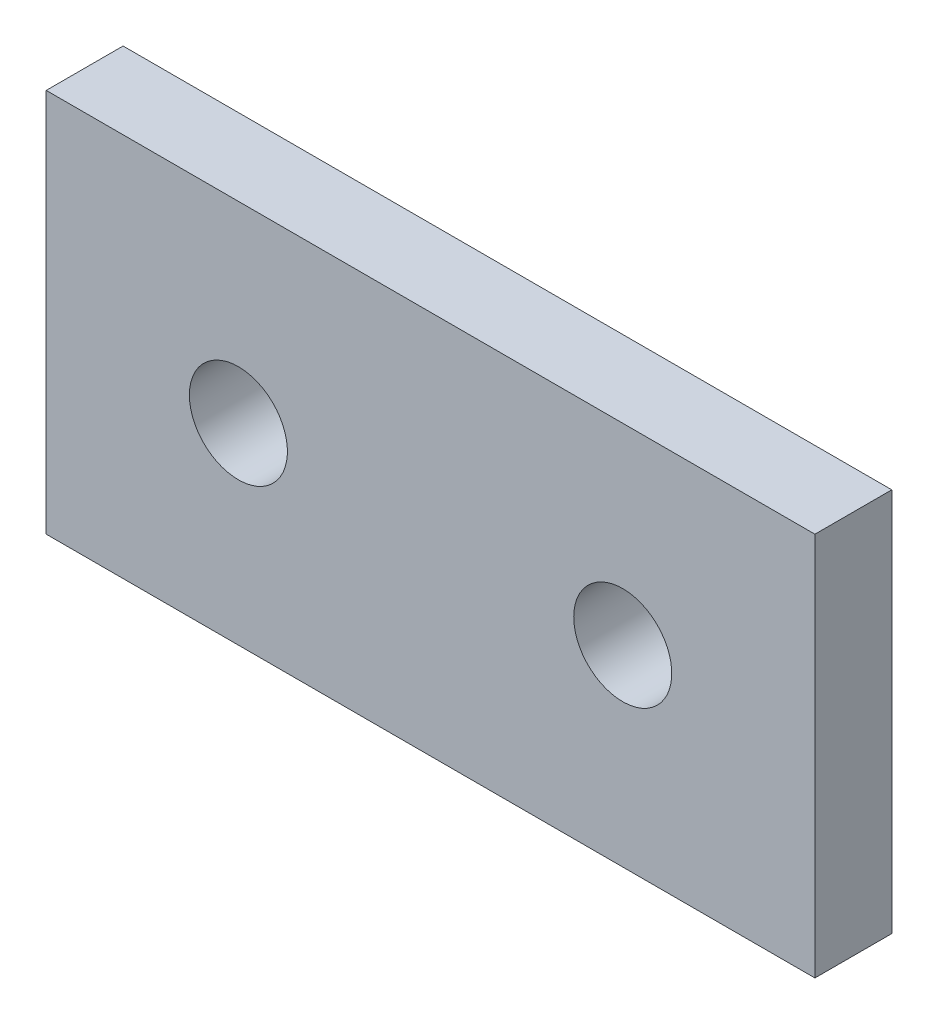
ISO-10303-21;
HEADER;
FILE_DESCRIPTION(('STEP AP214'),'2;1');
FILE_NAME('part.step','',(''),(''),'','','');
FILE_SCHEMA(('AUTOMOTIVE_DESIGN { 1 0 10303 214 1 1 1 1 }'));
ENDSEC;
DATA;
#1=APPLICATION_CONTEXT('core data for automotive mechanical design processes');
#2=APPLICATION_PROTOCOL_DEFINITION('international standard','automotive_design',2000,#1);
#3=PRODUCT_CONTEXT('',#1,'mechanical');
#4=PRODUCT('Part','Part','',(#3));
#5=PRODUCT_RELATED_PRODUCT_CATEGORY('part','',(#4));
#6=PRODUCT_DEFINITION_FORMATION('','',#4);
#7=PRODUCT_DEFINITION_CONTEXT('part definition',#1,'design');
#8=PRODUCT_DEFINITION('design','',#6,#7);
#9=PRODUCT_DEFINITION_SHAPE('','',#8);
#10=(LENGTH_UNIT() NAMED_UNIT(*) SI_UNIT(.MILLI.,.METRE.));
#11=(NAMED_UNIT(*) PLANE_ANGLE_UNIT() SI_UNIT($,.RADIAN.));
#12=(NAMED_UNIT(*) SI_UNIT($,.STERADIAN.) SOLID_ANGLE_UNIT());
#13=UNCERTAINTY_MEASURE_WITH_UNIT(LENGTH_MEASURE(1.E-05),#10,'distance_accuracy_value','');
#14=(GEOMETRIC_REPRESENTATION_CONTEXT(3) GLOBAL_UNCERTAINTY_ASSIGNED_CONTEXT((#13)) GLOBAL_UNIT_ASSIGNED_CONTEXT((#10,
#11,#12)) REPRESENTATION_CONTEXT('',''));
#15=CARTESIAN_POINT('',(0.,0.,0.));
#16=DIRECTION('',(0.,0.,1.));
#17=DIRECTION('',(1.,0.,0.));
#18=AXIS2_PLACEMENT_3D('',#15,#16,#17);
#19=CARTESIAN_POINT('',(20.,10.,0.));
#20=DIRECTION('',(0.,0.,1.));
#21=DIRECTION('',(1.,0.,0.));
#22=AXIS2_PLACEMENT_3D('',#19,#20,#21);
#23=PLANE('',#22);
#24=CARTESIAN_POINT('',(30.,10.,0.));
#25=DIRECTION('',(0.,0.,-1.));
#26=DIRECTION('',(1.,0.,0.));
#27=AXIS2_PLACEMENT_3D('',#24,#25,#26);
#28=CIRCLE('',#27,2.55);
#29=CARTESIAN_POINT('',(27.45,10.,0.));
#30=VERTEX_POINT('',#29);
#31=EDGE_CURVE('E74',#30,#30,#28,.T.);
#32=ORIENTED_EDGE('',*,*,#31,.F.);
#33=EDGE_LOOP('',(#32));
#34=FACE_BOUND('',#33,.T.);
#35=CARTESIAN_POINT('',(10.,10.,0.));
#36=DIRECTION('',(0.,0.,-1.));
#37=DIRECTION('',(1.,0.,0.));
#38=AXIS2_PLACEMENT_3D('',#35,#36,#37);
#39=CIRCLE('',#38,2.55);
#40=CARTESIAN_POINT('',(7.45,10.,0.));
#41=VERTEX_POINT('',#40);
#42=EDGE_CURVE('E143',#41,#41,#39,.T.);
#43=ORIENTED_EDGE('',*,*,#42,.F.);
#44=EDGE_LOOP('',(#43));
#45=FACE_BOUND('',#44,.T.);
#46=DIRECTION('',(0.,-1.,0.));
#47=VECTOR('',#46,1.);
#48=CARTESIAN_POINT('',(0.,20.,0.));
#49=LINE('',#48,#47);
#50=CARTESIAN_POINT('',(0.,20.,0.));
#51=VERTEX_POINT('',#50);
#52=CARTESIAN_POINT('',(0.,0.,0.));
#53=VERTEX_POINT('',#52);
#54=EDGE_CURVE('E28',#51,#53,#49,.T.);
#55=ORIENTED_EDGE('',*,*,#54,.F.);
#56=DIRECTION('',(-1.,0.,0.));
#57=VECTOR('',#56,1.);
#58=CARTESIAN_POINT('',(40.,20.,0.));
#59=LINE('',#58,#57);
#60=CARTESIAN_POINT('',(40.,20.,0.));
#61=VERTEX_POINT('',#60);
#62=EDGE_CURVE('E145',#61,#51,#59,.T.);
#63=ORIENTED_EDGE('',*,*,#62,.F.);
#64=DIRECTION('',(0.,1.,0.));
#65=VECTOR('',#64,1.);
#66=CARTESIAN_POINT('',(40.,0.,0.));
#67=LINE('',#66,#65);
#68=CARTESIAN_POINT('',(40.,0.,0.));
#69=VERTEX_POINT('',#68);
#70=EDGE_CURVE('E97',#69,#61,#67,.T.);
#71=ORIENTED_EDGE('',*,*,#70,.F.);
#72=DIRECTION('',(1.,0.,0.));
#73=VECTOR('',#72,1.);
#74=CARTESIAN_POINT('',(0.,0.,0.));
#75=LINE('',#74,#73);
#76=EDGE_CURVE('E109',#53,#69,#75,.T.);
#77=ORIENTED_EDGE('',*,*,#76,.F.);
#78=EDGE_LOOP('',(#55,#63,#71,#77));
#79=FACE_BOUND('',#78,.T.);
#80=ADVANCED_FACE('F17',(#34,#45,#79),#23,.F.);
#81=CARTESIAN_POINT('',(20.,10.,4.));
#82=DIRECTION('',(0.,0.,1.));
#83=DIRECTION('',(1.,0.,0.));
#84=AXIS2_PLACEMENT_3D('',#81,#82,#83);
#85=PLANE('',#84);
#86=CARTESIAN_POINT('',(30.,10.,4.));
#87=DIRECTION('',(0.,0.,-1.));
#88=DIRECTION('',(1.,0.,0.));
#89=AXIS2_PLACEMENT_3D('',#86,#87,#88);
#90=CIRCLE('',#89,2.55);
#91=CARTESIAN_POINT('',(27.45,10.,4.));
#92=VERTEX_POINT('',#91);
#93=EDGE_CURVE('E133',#92,#92,#90,.T.);
#94=ORIENTED_EDGE('',*,*,#93,.T.);
#95=EDGE_LOOP('',(#94));
#96=FACE_BOUND('',#95,.T.);
#97=CARTESIAN_POINT('',(10.,10.,4.));
#98=DIRECTION('',(0.,0.,-1.));
#99=DIRECTION('',(1.,0.,0.));
#100=AXIS2_PLACEMENT_3D('',#97,#98,#99);
#101=CIRCLE('',#100,2.55);
#102=CARTESIAN_POINT('',(7.45,10.,4.));
#103=VERTEX_POINT('',#102);
#104=EDGE_CURVE('E137',#103,#103,#101,.T.);
#105=ORIENTED_EDGE('',*,*,#104,.T.);
#106=EDGE_LOOP('',(#105));
#107=FACE_BOUND('',#106,.T.);
#108=DIRECTION('',(0.,-1.,0.));
#109=VECTOR('',#108,1.);
#110=CARTESIAN_POINT('',(0.,20.,4.));
#111=LINE('',#110,#109);
#112=CARTESIAN_POINT('',(0.,20.,4.));
#113=VERTEX_POINT('',#112);
#114=CARTESIAN_POINT('',(0.,0.,4.));
#115=VERTEX_POINT('',#114);
#116=EDGE_CURVE('E11',#113,#115,#111,.T.);
#117=ORIENTED_EDGE('',*,*,#116,.T.);
#118=DIRECTION('',(1.,0.,0.));
#119=VECTOR('',#118,1.);
#120=CARTESIAN_POINT('',(0.,0.,4.));
#121=LINE('',#120,#119);
#122=CARTESIAN_POINT('',(40.,0.,4.));
#123=VERTEX_POINT('',#122);
#124=EDGE_CURVE('E112',#115,#123,#121,.T.);
#125=ORIENTED_EDGE('',*,*,#124,.T.);
#126=DIRECTION('',(0.,1.,0.));
#127=VECTOR('',#126,1.);
#128=CARTESIAN_POINT('',(40.,0.,4.));
#129=LINE('',#128,#127);
#130=CARTESIAN_POINT('',(40.,20.,4.));
#131=VERTEX_POINT('',#130);
#132=EDGE_CURVE('E103',#123,#131,#129,.T.);
#133=ORIENTED_EDGE('',*,*,#132,.T.);
#134=DIRECTION('',(-1.,0.,0.));
#135=VECTOR('',#134,1.);
#136=CARTESIAN_POINT('',(40.,20.,4.));
#137=LINE('',#136,#135);
#138=EDGE_CURVE('E136',#131,#113,#137,.T.);
#139=ORIENTED_EDGE('',*,*,#138,.T.);
#140=EDGE_LOOP('',(#117,#125,#133,#139));
#141=FACE_BOUND('',#140,.T.);
#142=ADVANCED_FACE('F113',(#96,#107,#141),#85,.T.);
#143=CARTESIAN_POINT('',(0.,20.,0.));
#144=DIRECTION('',(-1.,0.,0.));
#145=DIRECTION('',(0.,0.,1.));
#146=AXIS2_PLACEMENT_3D('',#143,#144,#145);
#147=PLANE('',#146);
#148=ORIENTED_EDGE('',*,*,#54,.T.);
#149=DIRECTION('',(0.,0.,1.));
#150=VECTOR('',#149,1.);
#151=CARTESIAN_POINT('',(0.,0.,0.));
#152=LINE('',#151,#150);
#153=EDGE_CURVE('E115',#53,#115,#152,.T.);
#154=ORIENTED_EDGE('',*,*,#153,.T.);
#155=ORIENTED_EDGE('',*,*,#116,.F.);
#156=DIRECTION('',(0.,0.,1.));
#157=VECTOR('',#156,1.);
#158=CARTESIAN_POINT('',(0.,20.,0.));
#159=LINE('',#158,#157);
#160=EDGE_CURVE('E142',#51,#113,#159,.T.);
#161=ORIENTED_EDGE('',*,*,#160,.F.);
#162=EDGE_LOOP('',(#148,#154,#155,#161));
#163=FACE_BOUND('',#162,.T.);
#164=ADVANCED_FACE('F200',(#163),#147,.T.);
#165=CARTESIAN_POINT('',(0.,0.,0.));
#166=DIRECTION('',(0.,-1.,0.));
#167=DIRECTION('',(0.,0.,-1.));
#168=AXIS2_PLACEMENT_3D('',#165,#166,#167);
#169=PLANE('',#168);
#170=ORIENTED_EDGE('',*,*,#76,.T.);
#171=DIRECTION('',(0.,0.,1.));
#172=VECTOR('',#171,1.);
#173=CARTESIAN_POINT('',(40.,0.,0.));
#174=LINE('',#173,#172);
#175=EDGE_CURVE('E21',#69,#123,#174,.T.);
#176=ORIENTED_EDGE('',*,*,#175,.T.);
#177=ORIENTED_EDGE('',*,*,#124,.F.);
#178=ORIENTED_EDGE('',*,*,#153,.F.);
#179=EDGE_LOOP('',(#170,#176,#177,#178));
#180=FACE_BOUND('',#179,.T.);
#181=ADVANCED_FACE('F117',(#180),#169,.T.);
#182=CARTESIAN_POINT('',(40.,0.,0.));
#183=DIRECTION('',(1.,0.,0.));
#184=DIRECTION('',(0.,1.,0.));
#185=AXIS2_PLACEMENT_3D('',#182,#183,#184);
#186=PLANE('',#185);
#187=ORIENTED_EDGE('',*,*,#70,.T.);
#188=DIRECTION('',(0.,0.,1.));
#189=VECTOR('',#188,1.);
#190=CARTESIAN_POINT('',(40.,20.,0.));
#191=LINE('',#190,#189);
#192=EDGE_CURVE('E120',#61,#131,#191,.T.);
#193=ORIENTED_EDGE('',*,*,#192,.T.);
#194=ORIENTED_EDGE('',*,*,#132,.F.);
#195=ORIENTED_EDGE('',*,*,#175,.F.);
#196=EDGE_LOOP('',(#187,#193,#194,#195));
#197=FACE_BOUND('',#196,.T.);
#198=ADVANCED_FACE('F119',(#197),#186,.T.);
#199=CARTESIAN_POINT('',(40.,20.,0.));
#200=DIRECTION('',(0.,1.,0.));
#201=DIRECTION('',(1.,0.,0.));
#202=AXIS2_PLACEMENT_3D('',#199,#200,#201);
#203=PLANE('',#202);
#204=ORIENTED_EDGE('',*,*,#62,.T.);
#205=ORIENTED_EDGE('',*,*,#160,.T.);
#206=ORIENTED_EDGE('',*,*,#138,.F.);
#207=ORIENTED_EDGE('',*,*,#192,.F.);
#208=EDGE_LOOP('',(#204,#205,#206,#207));
#209=FACE_BOUND('',#208,.T.);
#210=ADVANCED_FACE('F180',(#209),#203,.T.);
#211=CARTESIAN_POINT('',(10.,10.,0.));
#212=DIRECTION('',(0.,0.,1.));
#213=DIRECTION('',(1.,0.,0.));
#214=AXIS2_PLACEMENT_3D('',#211,#212,#213);
#215=CYLINDRICAL_SURFACE('',#214,2.55);
#216=ORIENTED_EDGE('',*,*,#104,.F.);
#217=DIRECTION('',(0.,0.,-1.));
#218=VECTOR('',#217,1.);
#219=CARTESIAN_POINT('',(7.45,10.,0.));
#220=LINE('',#219,#218);
#221=EDGE_CURVE('E61',#103,#41,#220,.T.);
#222=ORIENTED_EDGE('',*,*,#221,.T.);
#223=ORIENTED_EDGE('',*,*,#42,.T.);
#224=ORIENTED_EDGE('',*,*,#221,.F.);
#225=EDGE_LOOP('',(#216,#222,#223,#224));
#226=FACE_BOUND('',#225,.T.);
#227=ADVANCED_FACE('F175',(#226),#215,.F.);
#228=CARTESIAN_POINT('',(30.,10.,0.));
#229=DIRECTION('',(0.,0.,1.));
#230=DIRECTION('',(1.,0.,0.));
#231=AXIS2_PLACEMENT_3D('',#228,#229,#230);
#232=CYLINDRICAL_SURFACE('',#231,2.55);
#233=ORIENTED_EDGE('',*,*,#93,.F.);
#234=DIRECTION('',(0.,0.,-1.));
#235=VECTOR('',#234,1.);
#236=CARTESIAN_POINT('',(27.45,10.,0.));
#237=LINE('',#236,#235);
#238=EDGE_CURVE('E130',#92,#30,#237,.T.);
#239=ORIENTED_EDGE('',*,*,#238,.T.);
#240=ORIENTED_EDGE('',*,*,#31,.T.);
#241=ORIENTED_EDGE('',*,*,#238,.F.);
#242=EDGE_LOOP('',(#233,#239,#240,#241));
#243=FACE_BOUND('',#242,.T.);
#244=ADVANCED_FACE('F19',(#243),#232,.F.);
#245=CLOSED_SHELL('',(#80,#142,#164,#181,#198,#210,#227,#244));
#246=MANIFOLD_SOLID_BREP('B1',#245);
#247=ADVANCED_BREP_SHAPE_REPRESENTATION('',(#18,#246),#14);
#248=SHAPE_DEFINITION_REPRESENTATION(#9,#247);
ENDSEC;
END-ISO-10303-21;
